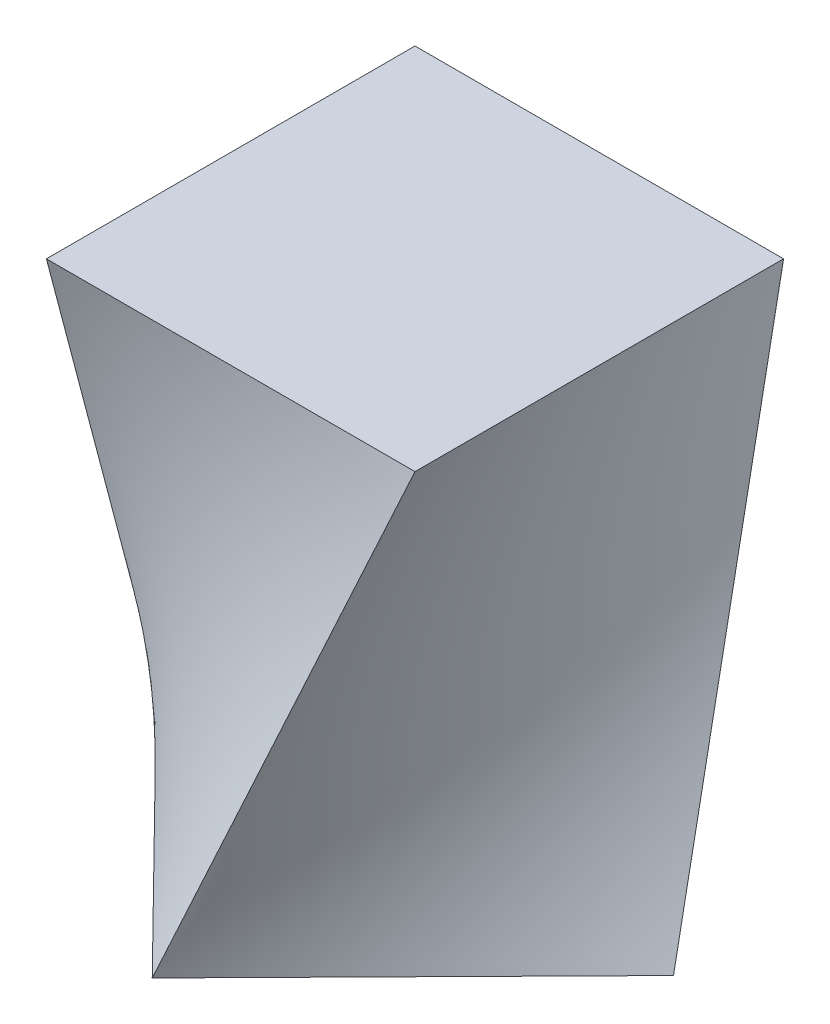
ISO-10303-21;
HEADER;
FILE_DESCRIPTION(('STEP AP214'),'2;1');
FILE_NAME('part.step','',(''),(''),'','','');
FILE_SCHEMA(('AUTOMOTIVE_DESIGN { 1 0 10303 214 1 1 1 1 }'));
ENDSEC;
DATA;
#1=APPLICATION_CONTEXT('core data for automotive mechanical design processes');
#2=APPLICATION_PROTOCOL_DEFINITION('international standard','automotive_design',2000,#1);
#3=PRODUCT_CONTEXT('',#1,'mechanical');
#4=PRODUCT('Part','Part','',(#3));
#5=PRODUCT_RELATED_PRODUCT_CATEGORY('part','',(#4));
#6=PRODUCT_DEFINITION_FORMATION('','',#4);
#7=PRODUCT_DEFINITION_CONTEXT('part definition',#1,'design');
#8=PRODUCT_DEFINITION('design','',#6,#7);
#9=PRODUCT_DEFINITION_SHAPE('','',#8);
#10=(LENGTH_UNIT() NAMED_UNIT(*) SI_UNIT(.MILLI.,.METRE.));
#11=(NAMED_UNIT(*) PLANE_ANGLE_UNIT() SI_UNIT($,.RADIAN.));
#12=(NAMED_UNIT(*) SI_UNIT($,.STERADIAN.) SOLID_ANGLE_UNIT());
#13=UNCERTAINTY_MEASURE_WITH_UNIT(LENGTH_MEASURE(1.E-05),#10,'distance_accuracy_value','');
#14=(GEOMETRIC_REPRESENTATION_CONTEXT(3) GLOBAL_UNCERTAINTY_ASSIGNED_CONTEXT((#13)) GLOBAL_UNIT_ASSIGNED_CONTEXT((#10,
#11,#12)) REPRESENTATION_CONTEXT('',''));
#15=CARTESIAN_POINT('',(0.,0.,0.));
#16=DIRECTION('',(0.,0.,1.));
#17=DIRECTION('',(1.,0.,0.));
#18=AXIS2_PLACEMENT_3D('',#15,#16,#17);
#19=CARTESIAN_POINT('',(0.,80.,0.));
#20=DIRECTION('',(0.,-1.,0.));
#21=DIRECTION('',(0.,0.,-1.));
#22=AXIS2_PLACEMENT_3D('',#19,#20,#21);
#23=PLANE('',#22);
#24=DIRECTION('',(0.,0.,-1.));
#25=VECTOR('',#24,1.);
#26=CARTESIAN_POINT('',(30.,80.,30.));
#27=LINE('',#26,#25);
#28=CARTESIAN_POINT('',(30.,80.,30.));
#29=VERTEX_POINT('',#28);
#30=CARTESIAN_POINT('',(30.,80.,-30.));
#31=VERTEX_POINT('',#30);
#32=EDGE_CURVE('E217',#29,#31,#27,.T.);
#33=ORIENTED_EDGE('',*,*,#32,.T.);
#34=DIRECTION('',(-1.,0.,0.));
#35=VECTOR('',#34,1.);
#36=CARTESIAN_POINT('',(-30.,80.,-30.));
#37=LINE('',#36,#35);
#38=CARTESIAN_POINT('',(-30.,80.,-30.));
#39=VERTEX_POINT('',#38);
#40=EDGE_CURVE('E185',#31,#39,#37,.T.);
#41=ORIENTED_EDGE('',*,*,#40,.T.);
#42=DIRECTION('',(0.,0.,1.));
#43=VECTOR('',#42,1.);
#44=CARTESIAN_POINT('',(-30.,80.,30.));
#45=LINE('',#44,#43);
#46=CARTESIAN_POINT('',(-30.,80.,30.));
#47=VERTEX_POINT('',#46);
#48=EDGE_CURVE('E60',#39,#47,#45,.T.);
#49=ORIENTED_EDGE('',*,*,#48,.T.);
#50=DIRECTION('',(1.,0.,0.));
#51=VECTOR('',#50,1.);
#52=CARTESIAN_POINT('',(-30.,80.,30.));
#53=LINE('',#52,#51);
#54=EDGE_CURVE('E12',#47,#29,#53,.T.);
#55=ORIENTED_EDGE('',*,*,#54,.T.);
#56=EDGE_LOOP('',(#33,#41,#49,#55));
#57=FACE_BOUND('',#56,.T.);
#58=ADVANCED_FACE('F49',(#57),#23,.F.);
#59=CARTESIAN_POINT('',(0.,0.,0.));
#60=DIRECTION('',(0.,-1.,0.));
#61=DIRECTION('',(0.,0.,-1.));
#62=AXIS2_PLACEMENT_3D('',#59,#60,#61);
#63=PLANE('',#62);
#64=DIRECTION('',(0.701287265932025,0.,-0.712878790988752));
#65=VECTOR('',#64,1.);
#66=CARTESIAN_POINT('',(0.,0.,42.7727274593251));
#67=LINE('',#66,#65);
#68=CARTESIAN_POINT('',(0.,0.,42.7727274593251));
#69=VERTEX_POINT('',#68);
#70=CARTESIAN_POINT('',(42.0772359559215,0.,0.));
#71=VERTEX_POINT('',#70);
#72=EDGE_CURVE('E102',#69,#71,#67,.T.);
#73=ORIENTED_EDGE('',*,*,#72,.F.);
#74=DIRECTION('',(0.701287265932025,0.,0.712878790988752));
#75=VECTOR('',#74,1.);
#76=CARTESIAN_POINT('',(-42.0772359559215,0.,0.));
#77=LINE('',#76,#75);
#78=CARTESIAN_POINT('',(-42.0772359559215,0.,0.));
#79=VERTEX_POINT('',#78);
#80=EDGE_CURVE('E95',#79,#69,#77,.T.);
#81=ORIENTED_EDGE('',*,*,#80,.F.);
#82=DIRECTION('',(-0.701287265932025,0.,0.712878790988753));
#83=VECTOR('',#82,1.);
#84=CARTESIAN_POINT('',(-42.0772359559215,0.,0.));
#85=LINE('',#84,#83);
#86=CARTESIAN_POINT('',(0.,0.,-42.7727274593251));
#87=VERTEX_POINT('',#86);
#88=EDGE_CURVE('E98',#87,#79,#85,.T.);
#89=ORIENTED_EDGE('',*,*,#88,.F.);
#90=DIRECTION('',(-0.701287265932025,0.,-0.712878790988752));
#91=VECTOR('',#90,1.);
#92=CARTESIAN_POINT('',(0.,0.,-42.7727274593251));
#93=LINE('',#92,#91);
#94=EDGE_CURVE('E117',#71,#87,#93,.T.);
#95=ORIENTED_EDGE('',*,*,#94,.F.);
#96=EDGE_LOOP('',(#73,#81,#89,#95));
#97=FACE_BOUND('',#96,.T.);
#98=ADVANCED_FACE('F97',(#97),#63,.T.);
#99=CARTESIAN_POINT('',(-42.0772359559215,0.,0.));
#100=CARTESIAN_POINT('',(-30.,80.,30.));
#101=CARTESIAN_POINT('',(-35.0643632966012,0.,7.12878790988752));
#102=CARTESIAN_POINT('',(-20.,80.,30.));
#103=CARTESIAN_POINT('',(-28.051490637281,0.,14.257575819775));
#104=CARTESIAN_POINT('',(-10.,80.,30.));
#105=CARTESIAN_POINT('',(-14.0257453186405,0.,28.5151516395501));
#106=CARTESIAN_POINT('',(9.99999999999999,80.,30.));
#107=CARTESIAN_POINT('',(-7.01287265932025,0.,35.6439395494376));
#108=CARTESIAN_POINT('',(20.,80.,30.));
#109=CARTESIAN_POINT('',(0.,0.,42.7727274593251));
#110=CARTESIAN_POINT('',(30.,80.,30.));
#111=B_SPLINE_SURFACE_WITH_KNOTS('',3,1,((#99,#100),(#101,#102),(#103,#104),(#105,#106),(#107,
#108),(#109,#110)),.UNSPECIFIED.,.F.,.F.,.F.,(4,2,4),(2,2),(0.,0.5,1.),(0.,1.),.UNSPECIFIED.);
#112=DIRECTION('',(0.347264497630475,0.926038660347932,-0.147850492817784));
#113=VECTOR('',#112,1.);
#114=CARTESIAN_POINT('',(15.,40.,36.3863637296626));
#115=LINE('',#114,#113);
#116=EDGE_CURVE('E124',#69,#29,#115,.T.);
#117=DIRECTION('',(-0.139961996552403,-0.927112773573192,-0.347667290089947));
#118=VECTOR('',#117,1.);
#119=CARTESIAN_POINT('',(-36.0386179779607,40.,15.));
#120=LINE('',#119,#118);
#121=EDGE_CURVE('E75',#47,#79,#120,.T.);
#122=ORIENTED_EDGE('',*,*,#80,.T.);
#123=ORIENTED_EDGE('',*,*,#116,.T.);
#124=ORIENTED_EDGE('',*,*,#54,.F.);
#125=ORIENTED_EDGE('',*,*,#121,.T.);
#126=EDGE_LOOP('',(#122,#123,#124,#125));
#127=FACE_BOUND('',#126,.T.);
#128=ADVANCED_FACE('F121',(#127),#111,.T.);
#129=CARTESIAN_POINT('',(0.,0.,42.7727274593251));
#130=CARTESIAN_POINT('',(30.,80.,30.));
#131=CARTESIAN_POINT('',(7.01287265932029,0.,35.6439395494376));
#132=CARTESIAN_POINT('',(30.,80.,20.));
#133=CARTESIAN_POINT('',(14.0257453186406,0.,28.51515163955));
#134=CARTESIAN_POINT('',(30.,80.,10.));
#135=CARTESIAN_POINT('',(28.0514906372811,0.,14.257575819775));
#136=CARTESIAN_POINT('',(30.,80.,-9.99999999999998));
#137=CARTESIAN_POINT('',(35.0643632966013,0.,7.12878790988749));
#138=CARTESIAN_POINT('',(30.,80.,-20.));
#139=CARTESIAN_POINT('',(42.0772359559215,0.,0.));
#140=CARTESIAN_POINT('',(30.,80.,-30.));
#141=B_SPLINE_SURFACE_WITH_KNOTS('',3,1,((#129,#130),(#131,#132),(#133,#134),(#135,#136),(#137,
#138),(#139,#140)),.UNSPECIFIED.,.F.,.F.,.F.,(4,2,4),(2,2),(0.,0.5,1.),(0.,1.),.UNSPECIFIED.);
#142=DIRECTION('',(-0.139961996552403,0.927112773573192,-0.347667290089947));
#143=VECTOR('',#142,1.);
#144=CARTESIAN_POINT('',(36.0386179779607,40.,-15.));
#145=LINE('',#144,#143);
#146=EDGE_CURVE('E127',#71,#31,#145,.T.);
#147=ORIENTED_EDGE('',*,*,#72,.T.);
#148=ORIENTED_EDGE('',*,*,#146,.T.);
#149=ORIENTED_EDGE('',*,*,#32,.F.);
#150=ORIENTED_EDGE('',*,*,#116,.F.);
#151=EDGE_LOOP('',(#147,#148,#149,#150));
#152=FACE_BOUND('',#151,.T.);
#153=ADVANCED_FACE('F147',(#152),#141,.T.);
#154=CARTESIAN_POINT('',(0.,0.,-42.7727274593252));
#155=CARTESIAN_POINT('',(-30.,80.,-30.));
#156=CARTESIAN_POINT('',(-7.01287265932037,0.,-35.6439395494375));
#157=CARTESIAN_POINT('',(-30.,80.,-20.));
#158=CARTESIAN_POINT('',(-14.0257453186407,0.,-28.5151516395499));
#159=CARTESIAN_POINT('',(-30.,80.,-9.99999999999994));
#160=CARTESIAN_POINT('',(-28.0514906372812,0.,-14.2575758197749));
#161=CARTESIAN_POINT('',(-30.,80.,10.0000000000001));
#162=CARTESIAN_POINT('',(-35.0643632966014,0.,-7.12878790988741));
#163=CARTESIAN_POINT('',(-30.,80.,20.));
#164=CARTESIAN_POINT('',(-42.0772359559215,0.,0.));
#165=CARTESIAN_POINT('',(-30.,80.,30.));
#166=B_SPLINE_SURFACE_WITH_KNOTS('',3,1,((#154,#155),(#156,#157),(#158,#159),(#160,#161),(#162,
#163),(#164,#165)),.UNSPECIFIED.,.F.,.F.,.F.,(4,2,4),(2,2),(0.,0.5,1.),(0.,1.),.UNSPECIFIED.);
#167=DIRECTION('',(-0.347264497630474,0.926038660347932,0.147850492817784));
#168=VECTOR('',#167,1.);
#169=CARTESIAN_POINT('',(-15.,40.,-36.3863637296626));
#170=LINE('',#169,#168);
#171=EDGE_CURVE('E115',#87,#39,#170,.T.);
#172=ORIENTED_EDGE('',*,*,#88,.T.);
#173=ORIENTED_EDGE('',*,*,#121,.F.);
#174=ORIENTED_EDGE('',*,*,#48,.F.);
#175=ORIENTED_EDGE('',*,*,#171,.F.);
#176=EDGE_LOOP('',(#172,#173,#174,#175));
#177=FACE_BOUND('',#176,.T.);
#178=ADVANCED_FACE('F113',(#177),#166,.T.);
#179=CARTESIAN_POINT('',(42.0772359559215,0.,0.));
#180=CARTESIAN_POINT('',(30.,80.,-30.));
#181=CARTESIAN_POINT('',(35.0643632966013,0.,-7.12878790988746));
#182=CARTESIAN_POINT('',(20.,80.,-30.));
#183=CARTESIAN_POINT('',(28.0514906372811,0.,-14.257575819775));
#184=CARTESIAN_POINT('',(10.,80.,-30.));
#185=CARTESIAN_POINT('',(14.0257453186406,0.,-28.51515163955));
#186=CARTESIAN_POINT('',(-9.99999999999998,80.,-30.));
#187=CARTESIAN_POINT('',(7.0128726593203,0.,-35.6439395494375));
#188=CARTESIAN_POINT('',(-20.,80.,-30.));
#189=CARTESIAN_POINT('',(0.,0.,-42.7727274593251));
#190=CARTESIAN_POINT('',(-30.,80.,-30.));
#191=B_SPLINE_SURFACE_WITH_KNOTS('',3,1,((#179,#180),(#181,#182),(#183,#184),(#185,#186),(#187,
#188),(#189,#190)),.UNSPECIFIED.,.F.,.F.,.F.,(4,2,4),(2,2),(0.,0.5,1.),(0.,1.),.UNSPECIFIED.);
#192=ORIENTED_EDGE('',*,*,#94,.T.);
#193=ORIENTED_EDGE('',*,*,#171,.T.);
#194=ORIENTED_EDGE('',*,*,#40,.F.);
#195=ORIENTED_EDGE('',*,*,#146,.F.);
#196=EDGE_LOOP('',(#192,#193,#194,#195));
#197=FACE_BOUND('',#196,.T.);
#198=ADVANCED_FACE('F190',(#197),#191,.T.);
#199=CLOSED_SHELL('',(#58,#98,#128,#153,#178,#198));
#200=MANIFOLD_SOLID_BREP('B2',#199);
#201=ADVANCED_BREP_SHAPE_REPRESENTATION('',(#18,#200),#14);
#202=SHAPE_DEFINITION_REPRESENTATION(#9,#201);
ENDSEC;
END-ISO-10303-21;
